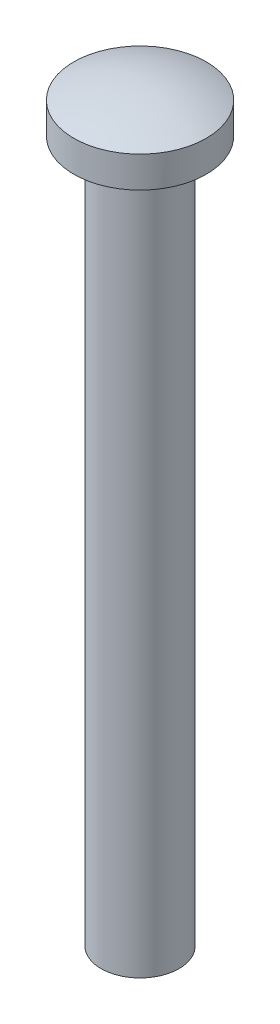
ISO-10303-21;
HEADER;
FILE_DESCRIPTION(('STEP AP214'),'2;1');
FILE_NAME('part.step','',(''),(''),'','','');
FILE_SCHEMA(('AUTOMOTIVE_DESIGN { 1 0 10303 214 1 1 1 1 }'));
ENDSEC;
DATA;
#1=APPLICATION_CONTEXT('core data for automotive mechanical design processes');
#2=APPLICATION_PROTOCOL_DEFINITION('international standard','automotive_design',2000,#1);
#3=PRODUCT_CONTEXT('',#1,'mechanical');
#4=PRODUCT('Part','Part','',(#3));
#5=PRODUCT_RELATED_PRODUCT_CATEGORY('part','',(#4));
#6=PRODUCT_DEFINITION_FORMATION('','',#4);
#7=PRODUCT_DEFINITION_CONTEXT('part definition',#1,'design');
#8=PRODUCT_DEFINITION('design','',#6,#7);
#9=PRODUCT_DEFINITION_SHAPE('','',#8);
#10=(LENGTH_UNIT() NAMED_UNIT(*) SI_UNIT(.MILLI.,.METRE.));
#11=(NAMED_UNIT(*) PLANE_ANGLE_UNIT() SI_UNIT($,.RADIAN.));
#12=(NAMED_UNIT(*) SI_UNIT($,.STERADIAN.) SOLID_ANGLE_UNIT());
#13=UNCERTAINTY_MEASURE_WITH_UNIT(LENGTH_MEASURE(1.E-05),#10,'distance_accuracy_value','');
#14=(GEOMETRIC_REPRESENTATION_CONTEXT(3) GLOBAL_UNCERTAINTY_ASSIGNED_CONTEXT((#13)) GLOBAL_UNIT_ASSIGNED_CONTEXT((#10,
#11,#12)) REPRESENTATION_CONTEXT('',''));
#15=CARTESIAN_POINT('',(0.,0.,0.));
#16=DIRECTION('',(0.,0.,1.));
#17=DIRECTION('',(1.,0.,0.));
#18=AXIS2_PLACEMENT_3D('',#15,#16,#17);
#19=CARTESIAN_POINT('',(-0.5,0.,0.));
#20=DIRECTION('',(0.,1.,0.));
#21=DIRECTION('',(0.,0.,1.));
#22=AXIS2_PLACEMENT_3D('',#19,#20,#21);
#23=PLANE('',#22);
#24=CARTESIAN_POINT('',(0.,0.,0.));
#25=DIRECTION('',(0.,-1.,0.));
#26=DIRECTION('',(0.,0.,-1.));
#27=AXIS2_PLACEMENT_3D('',#24,#25,#26);
#28=CIRCLE('',#27,0.5);
#29=CARTESIAN_POINT('',(0.,0.,-0.5));
#30=VERTEX_POINT('',#29);
#31=EDGE_CURVE('E49',#30,#30,#28,.T.);
#32=ORIENTED_EDGE('',*,*,#31,.T.);
#33=EDGE_LOOP('',(#32));
#34=FACE_BOUND('',#33,.T.);
#35=ADVANCED_FACE('F35',(#34),#23,.F.);
#36=CARTESIAN_POINT('',(0.,7.49485522042569,0.));
#37=DIRECTION('',(0.,-1.,0.));
#38=DIRECTION('',(1.,0.,0.));
#39=AXIS2_PLACEMENT_3D('',#36,#37,#38);
#40=SPHERICAL_SURFACE('',#39,2.08617938322771);
#41=CARTESIAN_POINT('',(0.,9.40001779065541,0.));
#42=DIRECTION('',(0.,-1.,0.));
#43=DIRECTION('',(0.,0.,-1.));
#44=AXIS2_PLACEMENT_3D('',#41,#42,#43);
#45=CIRCLE('',#44,0.85);
#46=CARTESIAN_POINT('',(0.,9.40001779065541,-0.85));
#47=VERTEX_POINT('',#46);
#48=EDGE_CURVE('E10',#47,#47,#45,.T.);
#49=ORIENTED_EDGE('',*,*,#48,.F.);
#50=EDGE_LOOP('',(#49));
#51=FACE_BOUND('',#50,.T.);
#52=ADVANCED_FACE('F69',(#51),#40,.T.);
#53=CARTESIAN_POINT('',(0.,0.,0.));
#54=DIRECTION('',(0.,-1.,0.));
#55=DIRECTION('',(0.,0.,-1.));
#56=AXIS2_PLACEMENT_3D('',#53,#54,#55);
#57=CYLINDRICAL_SURFACE('',#56,0.85);
#58=CARTESIAN_POINT('',(0.,9.,0.));
#59=DIRECTION('',(0.,-1.,0.));
#60=DIRECTION('',(0.,0.,-1.));
#61=AXIS2_PLACEMENT_3D('',#58,#59,#60);
#62=CIRCLE('',#61,0.85);
#63=CARTESIAN_POINT('',(0.,9.,-0.85));
#64=VERTEX_POINT('',#63);
#65=EDGE_CURVE('E41',#64,#64,#62,.T.);
#66=ORIENTED_EDGE('',*,*,#65,.F.);
#67=EDGE_LOOP('',(#66));
#68=FACE_BOUND('',#67,.T.);
#69=ORIENTED_EDGE('',*,*,#48,.T.);
#70=EDGE_LOOP('',(#69));
#71=FACE_BOUND('',#70,.T.);
#72=ADVANCED_FACE('F64',(#68,#71),#57,.T.);
#73=CARTESIAN_POINT('',(-0.85,9.,0.));
#74=DIRECTION('',(0.,1.,0.));
#75=DIRECTION('',(0.,0.,1.));
#76=AXIS2_PLACEMENT_3D('',#73,#74,#75);
#77=PLANE('',#76);
#78=CARTESIAN_POINT('',(0.,9.,0.));
#79=DIRECTION('',(0.,-1.,0.));
#80=DIRECTION('',(0.,0.,-1.));
#81=AXIS2_PLACEMENT_3D('',#78,#79,#80);
#82=CIRCLE('',#81,0.500000000000001);
#83=CARTESIAN_POINT('',(0.,9.,-0.500000000000001));
#84=VERTEX_POINT('',#83);
#85=EDGE_CURVE('E45',#84,#84,#82,.T.);
#86=ORIENTED_EDGE('',*,*,#85,.F.);
#87=EDGE_LOOP('',(#86));
#88=FACE_BOUND('',#87,.T.);
#89=ORIENTED_EDGE('',*,*,#65,.T.);
#90=EDGE_LOOP('',(#89));
#91=FACE_BOUND('',#90,.T.);
#92=ADVANCED_FACE('F59',(#88,#91),#77,.F.);
#93=CARTESIAN_POINT('',(0.,0.,0.));
#94=DIRECTION('',(0.,-1.,0.));
#95=DIRECTION('',(0.,0.,-1.));
#96=AXIS2_PLACEMENT_3D('',#93,#94,#95);
#97=CYLINDRICAL_SURFACE('',#96,0.500000000000001);
#98=ORIENTED_EDGE('',*,*,#31,.F.);
#99=EDGE_LOOP('',(#98));
#100=FACE_BOUND('',#99,.T.);
#101=ORIENTED_EDGE('',*,*,#85,.T.);
#102=EDGE_LOOP('',(#101));
#103=FACE_BOUND('',#102,.T.);
#104=ADVANCED_FACE('F56',(#100,#103),#97,.T.);
#105=CLOSED_SHELL('',(#35,#52,#72,#92,#104));
#106=MANIFOLD_SOLID_BREP('B2',#105);
#107=ADVANCED_BREP_SHAPE_REPRESENTATION('',(#18,#106),#14);
#108=SHAPE_DEFINITION_REPRESENTATION(#9,#107);
ENDSEC;
END-ISO-10303-21;
